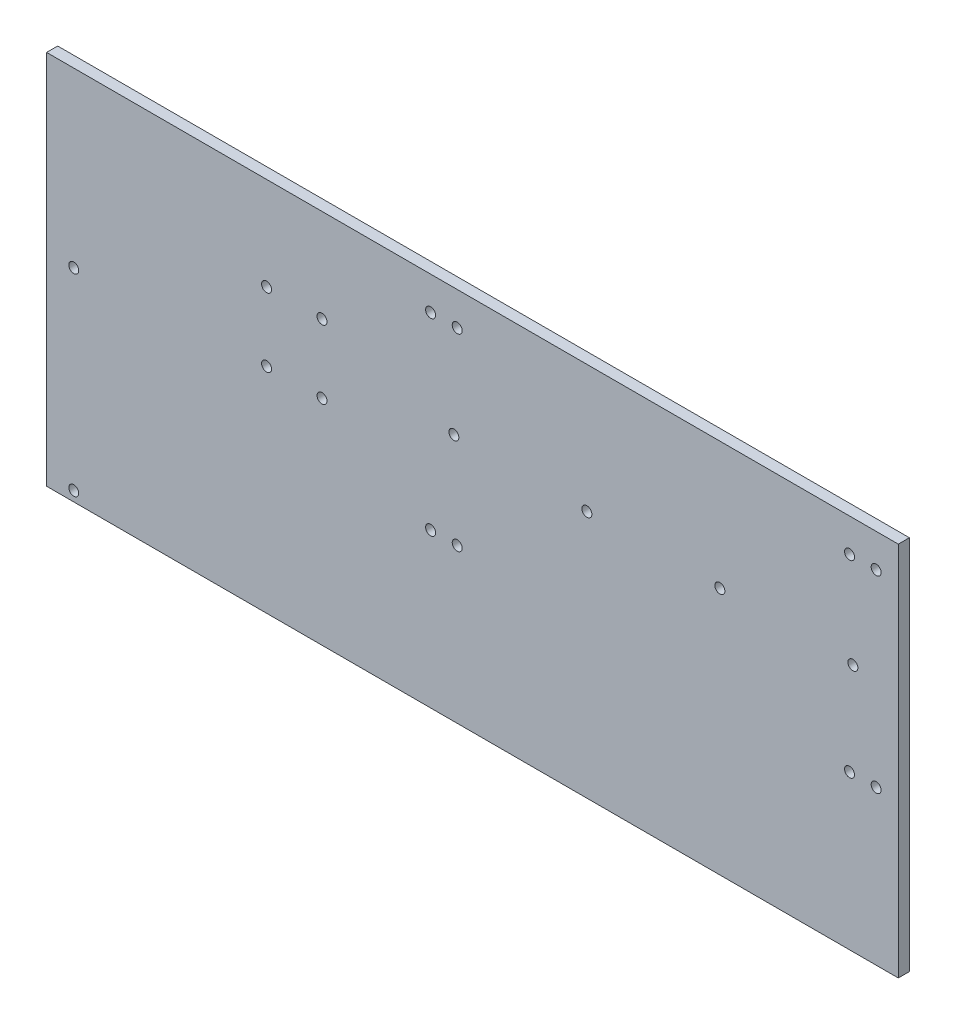
ISO-10303-21;
HEADER;
FILE_DESCRIPTION(('STEP AP214'),'2;1');
FILE_NAME('part.step','',(''),(''),'','','');
FILE_SCHEMA(('AUTOMOTIVE_DESIGN { 1 0 10303 214 1 1 1 1 }'));
ENDSEC;
DATA;
#1=APPLICATION_CONTEXT('core data for automotive mechanical design processes');
#2=APPLICATION_PROTOCOL_DEFINITION('international standard','automotive_design',2000,#1);
#3=PRODUCT_CONTEXT('',#1,'mechanical');
#4=PRODUCT('Part','Part','',(#3));
#5=PRODUCT_RELATED_PRODUCT_CATEGORY('part','',(#4));
#6=PRODUCT_DEFINITION_FORMATION('','',#4);
#7=PRODUCT_DEFINITION_CONTEXT('part definition',#1,'design');
#8=PRODUCT_DEFINITION('design','',#6,#7);
#9=PRODUCT_DEFINITION_SHAPE('','',#8);
#10=(LENGTH_UNIT() NAMED_UNIT(*) SI_UNIT(.MILLI.,.METRE.));
#11=(NAMED_UNIT(*) PLANE_ANGLE_UNIT() SI_UNIT($,.RADIAN.));
#12=(NAMED_UNIT(*) SI_UNIT($,.STERADIAN.) SOLID_ANGLE_UNIT());
#13=UNCERTAINTY_MEASURE_WITH_UNIT(LENGTH_MEASURE(1.E-05),#10,'distance_accuracy_value','');
#14=(GEOMETRIC_REPRESENTATION_CONTEXT(3) GLOBAL_UNCERTAINTY_ASSIGNED_CONTEXT((#13)) GLOBAL_UNIT_ASSIGNED_CONTEXT((#10,
#11,#12)) REPRESENTATION_CONTEXT('',''));
#15=CARTESIAN_POINT('',(0.,0.,0.));
#16=DIRECTION('',(0.,0.,1.));
#17=DIRECTION('',(1.,0.,0.));
#18=AXIS2_PLACEMENT_3D('',#15,#16,#17);
#19=CARTESIAN_POINT('',(192.118943375933,-84.7583573717352,5.));
#20=DIRECTION('',(-1.,0.,0.));
#21=DIRECTION('',(0.,0.,1.));
#22=AXIS2_PLACEMENT_3D('',#19,#20,#21);
#23=PLANE('',#22);
#24=DIRECTION('',(0.,1.,0.));
#25=VECTOR('',#24,1.);
#26=CARTESIAN_POINT('',(192.118943375933,-84.7583573717352,0.));
#27=LINE('',#26,#25);
#28=CARTESIAN_POINT('',(192.118943375933,-84.7583573717352,0.));
#29=VERTEX_POINT('',#28);
#30=CARTESIAN_POINT('',(192.118943375933,84.7583573717352,0.));
#31=VERTEX_POINT('',#30);
#32=EDGE_CURVE('E96',#29,#31,#27,.T.);
#33=ORIENTED_EDGE('',*,*,#32,.T.);
#34=DIRECTION('',(0.,0.,-1.));
#35=VECTOR('',#34,1.);
#36=CARTESIAN_POINT('',(192.118943375933,84.7583573717352,5.));
#37=LINE('',#36,#35);
#38=CARTESIAN_POINT('',(192.118943375933,84.7583573717352,5.));
#39=VERTEX_POINT('',#38);
#40=EDGE_CURVE('E11',#39,#31,#37,.T.);
#41=ORIENTED_EDGE('',*,*,#40,.F.);
#42=DIRECTION('',(0.,1.,0.));
#43=VECTOR('',#42,1.);
#44=CARTESIAN_POINT('',(192.118943375933,-84.7583573717352,5.));
#45=LINE('',#44,#43);
#46=CARTESIAN_POINT('',(192.118943375933,-84.7583573717352,5.));
#47=VERTEX_POINT('',#46);
#48=EDGE_CURVE('E84',#47,#39,#45,.T.);
#49=ORIENTED_EDGE('',*,*,#48,.F.);
#50=DIRECTION('',(0.,0.,-1.));
#51=VECTOR('',#50,1.);
#52=CARTESIAN_POINT('',(192.118943375933,-84.7583573717352,5.));
#53=LINE('',#52,#51);
#54=EDGE_CURVE('E92',#47,#29,#53,.T.);
#55=ORIENTED_EDGE('',*,*,#54,.T.);
#56=EDGE_LOOP('',(#33,#41,#49,#55));
#57=FACE_BOUND('',#56,.T.);
#58=ADVANCED_FACE('F33',(#57),#23,.F.);
#59=CARTESIAN_POINT('',(-192.118943375933,84.7583573717352,5.));
#60=DIRECTION('',(0.,-1.,0.));
#61=DIRECTION('',(0.,0.,-1.));
#62=AXIS2_PLACEMENT_3D('',#59,#60,#61);
#63=PLANE('',#62);
#64=DIRECTION('',(-1.,0.,0.));
#65=VECTOR('',#64,1.);
#66=CARTESIAN_POINT('',(-192.118943375933,84.7583573717352,0.));
#67=LINE('',#66,#65);
#68=CARTESIAN_POINT('',(-192.118943375933,84.7583573717352,0.));
#69=VERTEX_POINT('',#68);
#70=EDGE_CURVE('E88',#31,#69,#67,.T.);
#71=ORIENTED_EDGE('',*,*,#70,.T.);
#72=DIRECTION('',(0.,0.,-1.));
#73=VECTOR('',#72,1.);
#74=CARTESIAN_POINT('',(-192.118943375933,84.7583573717352,5.));
#75=LINE('',#74,#73);
#76=CARTESIAN_POINT('',(-192.118943375933,84.7583573717352,5.));
#77=VERTEX_POINT('',#76);
#78=EDGE_CURVE('E41',#77,#69,#75,.T.);
#79=ORIENTED_EDGE('',*,*,#78,.F.);
#80=DIRECTION('',(-1.,0.,0.));
#81=VECTOR('',#80,1.);
#82=CARTESIAN_POINT('',(-192.118943375933,84.7583573717352,5.));
#83=LINE('',#82,#81);
#84=EDGE_CURVE('E79',#39,#77,#83,.T.);
#85=ORIENTED_EDGE('',*,*,#84,.F.);
#86=ORIENTED_EDGE('',*,*,#40,.T.);
#87=EDGE_LOOP('',(#71,#79,#85,#86));
#88=FACE_BOUND('',#87,.T.);
#89=ADVANCED_FACE('F87',(#88),#63,.F.);
#90=CARTESIAN_POINT('',(-192.118943375933,-84.7583573717352,5.));
#91=DIRECTION('',(1.,0.,0.));
#92=DIRECTION('',(0.,0.,-1.));
#93=AXIS2_PLACEMENT_3D('',#90,#91,#92);
#94=PLANE('',#93);
#95=DIRECTION('',(0.,-1.,0.));
#96=VECTOR('',#95,1.);
#97=CARTESIAN_POINT('',(-192.118943375933,-84.7583573717352,0.));
#98=LINE('',#97,#96);
#99=CARTESIAN_POINT('',(-192.118943375933,-84.7583573717352,0.));
#100=VERTEX_POINT('',#99);
#101=EDGE_CURVE('E66',#69,#100,#98,.T.);
#102=ORIENTED_EDGE('',*,*,#101,.T.);
#103=DIRECTION('',(0.,0.,-1.));
#104=VECTOR('',#103,1.);
#105=CARTESIAN_POINT('',(-192.118943375933,-84.7583573717352,5.));
#106=LINE('',#105,#104);
#107=CARTESIAN_POINT('',(-192.118943375933,-84.7583573717352,5.));
#108=VERTEX_POINT('',#107);
#109=EDGE_CURVE('E89',#108,#100,#106,.T.);
#110=ORIENTED_EDGE('',*,*,#109,.F.);
#111=DIRECTION('',(0.,-1.,0.));
#112=VECTOR('',#111,1.);
#113=CARTESIAN_POINT('',(-192.118943375933,-84.7583573717352,5.));
#114=LINE('',#113,#112);
#115=EDGE_CURVE('E82',#77,#108,#114,.T.);
#116=ORIENTED_EDGE('',*,*,#115,.F.);
#117=ORIENTED_EDGE('',*,*,#78,.T.);
#118=EDGE_LOOP('',(#102,#110,#116,#117));
#119=FACE_BOUND('',#118,.T.);
#120=ADVANCED_FACE('F90',(#119),#94,.F.);
#121=CARTESIAN_POINT('',(-192.118943375933,-84.7583573717352,5.));
#122=DIRECTION('',(0.,1.,0.));
#123=DIRECTION('',(0.,0.,1.));
#124=AXIS2_PLACEMENT_3D('',#121,#122,#123);
#125=PLANE('',#124);
#126=DIRECTION('',(1.,0.,0.));
#127=VECTOR('',#126,1.);
#128=CARTESIAN_POINT('',(-192.118943375933,-84.7583573717352,0.));
#129=LINE('',#128,#127);
#130=EDGE_CURVE('E72',#100,#29,#129,.T.);
#131=ORIENTED_EDGE('',*,*,#130,.T.);
#132=ORIENTED_EDGE('',*,*,#54,.F.);
#133=DIRECTION('',(1.,0.,0.));
#134=VECTOR('',#133,1.);
#135=CARTESIAN_POINT('',(-192.118943375933,-84.7583573717352,5.));
#136=LINE('',#135,#134);
#137=EDGE_CURVE('E49',#108,#47,#136,.T.);
#138=ORIENTED_EDGE('',*,*,#137,.F.);
#139=ORIENTED_EDGE('',*,*,#109,.T.);
#140=EDGE_LOOP('',(#131,#132,#138,#139));
#141=FACE_BOUND('',#140,.T.);
#142=ADVANCED_FACE('F104',(#141),#125,.F.);
#143=CARTESIAN_POINT('',(0.,0.,5.));
#144=DIRECTION('',(0.,0.,-1.));
#145=DIRECTION('',(-1.,0.,0.));
#146=AXIS2_PLACEMENT_3D('',#143,#144,#145);
#147=PLANE('',#146);
#148=CARTESIAN_POINT('',(-179.868943375933,6.7416426282691,5.));
#149=DIRECTION('',(0.,0.,-1.));
#150=DIRECTION('',(-1.,0.,0.));
#151=AXIS2_PLACEMENT_3D('',#148,#149,#150);
#152=CIRCLE('',#151,2.25);
#153=CARTESIAN_POINT('',(-182.118943375933,6.7416426282691,5.));
#154=VERTEX_POINT('',#153);
#155=EDGE_CURVE('E211',#154,#154,#152,.T.);
#156=ORIENTED_EDGE('',*,*,#155,.T.);
#157=EDGE_LOOP('',(#156));
#158=FACE_BOUND('',#157,.T.);
#159=CARTESIAN_POINT('',(-179.868943375934,-80.2583573717309,5.));
#160=DIRECTION('',(0.,0.,-1.));
#161=DIRECTION('',(-1.,0.,0.));
#162=AXIS2_PLACEMENT_3D('',#159,#160,#161);
#163=CIRCLE('',#162,2.25);
#164=CARTESIAN_POINT('',(-182.118943375934,-80.2583573717309,5.));
#165=VERTEX_POINT('',#164);
#166=EDGE_CURVE('E205',#165,#165,#163,.T.);
#167=ORIENTED_EDGE('',*,*,#166,.T.);
#168=EDGE_LOOP('',(#167));
#169=FACE_BOUND('',#168,.T.);
#170=CARTESIAN_POINT('',(-92.8810566240669,42.7583573717334,5.));
#171=DIRECTION('',(0.,0.,-1.));
#172=DIRECTION('',(-1.,0.,0.));
#173=AXIS2_PLACEMENT_3D('',#170,#171,#172);
#174=CIRCLE('',#173,2.25);
#175=CARTESIAN_POINT('',(-95.1310566240669,42.7583573717334,5.));
#176=VERTEX_POINT('',#175);
#177=EDGE_CURVE('E199',#176,#176,#174,.T.);
#178=ORIENTED_EDGE('',*,*,#177,.T.);
#179=EDGE_LOOP('',(#178));
#180=FACE_BOUND('',#179,.T.);
#181=CARTESIAN_POINT('',(-92.8810566240669,11.7583573717333,5.));
#182=DIRECTION('',(0.,0.,-1.));
#183=DIRECTION('',(-1.,0.,0.));
#184=AXIS2_PLACEMENT_3D('',#181,#182,#183);
#185=CIRCLE('',#184,2.25);
#186=CARTESIAN_POINT('',(-95.1310566240669,11.7583573717333,5.));
#187=VERTEX_POINT('',#186);
#188=EDGE_CURVE('E193',#187,#187,#185,.T.);
#189=ORIENTED_EDGE('',*,*,#188,.T.);
#190=EDGE_LOOP('',(#189));
#191=FACE_BOUND('',#190,.T.);
#192=CARTESIAN_POINT('',(-67.8810566240669,11.7583573717336,5.));
#193=DIRECTION('',(0.,0.,-1.));
#194=DIRECTION('',(-1.,0.,0.));
#195=AXIS2_PLACEMENT_3D('',#192,#193,#194);
#196=CIRCLE('',#195,2.25);
#197=CARTESIAN_POINT('',(-70.1310566240669,11.7583573717336,5.));
#198=VERTEX_POINT('',#197);
#199=EDGE_CURVE('E187',#198,#198,#196,.T.);
#200=ORIENTED_EDGE('',*,*,#199,.T.);
#201=EDGE_LOOP('',(#200));
#202=FACE_BOUND('',#201,.T.);
#203=CARTESIAN_POINT('',(-67.8810566240669,42.7583573717335,5.));
#204=DIRECTION('',(0.,0.,-1.));
#205=DIRECTION('',(-1.,0.,0.));
#206=AXIS2_PLACEMENT_3D('',#203,#204,#205);
#207=CIRCLE('',#206,2.25);
#208=CARTESIAN_POINT('',(-70.1310566240669,42.7583573717335,5.));
#209=VERTEX_POINT('',#208);
#210=EDGE_CURVE('E181',#209,#209,#207,.T.);
#211=ORIENTED_EDGE('',*,*,#210,.T.);
#212=EDGE_LOOP('',(#211));
#213=FACE_BOUND('',#212,.T.);
#214=CARTESIAN_POINT('',(-18.8810566240669,69.758357371734,5.));
#215=DIRECTION('',(0.,0.,-1.));
#216=DIRECTION('',(-1.,0.,0.));
#217=AXIS2_PLACEMENT_3D('',#214,#215,#216);
#218=CIRCLE('',#217,2.25);
#219=CARTESIAN_POINT('',(-21.1310566240669,69.758357371734,5.));
#220=VERTEX_POINT('',#219);
#221=EDGE_CURVE('E175',#220,#220,#218,.T.);
#222=ORIENTED_EDGE('',*,*,#221,.T.);
#223=EDGE_LOOP('',(#222));
#224=FACE_BOUND('',#223,.T.);
#225=CARTESIAN_POINT('',(-6.88105662406685,69.758357371734,5.));
#226=DIRECTION('',(0.,0.,-1.));
#227=DIRECTION('',(-1.,0.,0.));
#228=AXIS2_PLACEMENT_3D('',#225,#226,#227);
#229=CIRCLE('',#228,2.25);
#230=CARTESIAN_POINT('',(-9.13105662406685,69.758357371734,5.));
#231=VERTEX_POINT('',#230);
#232=EDGE_CURVE('E169',#231,#231,#229,.T.);
#233=ORIENTED_EDGE('',*,*,#232,.T.);
#234=EDGE_LOOP('',(#233));
#235=FACE_BOUND('',#234,.T.);
#236=CARTESIAN_POINT('',(-8.38105662406685,27.2583573717339,5.));
#237=DIRECTION('',(0.,0.,-1.));
#238=DIRECTION('',(-1.,0.,0.));
#239=AXIS2_PLACEMENT_3D('',#236,#237,#238);
#240=CIRCLE('',#239,2.25);
#241=CARTESIAN_POINT('',(-10.6310566240669,27.2583573717339,5.));
#242=VERTEX_POINT('',#241);
#243=EDGE_CURVE('E163',#242,#242,#240,.T.);
#244=ORIENTED_EDGE('',*,*,#243,.T.);
#245=EDGE_LOOP('',(#244));
#246=FACE_BOUND('',#245,.T.);
#247=CARTESIAN_POINT('',(-18.8810566240669,-15.241642628266,5.));
#248=DIRECTION('',(0.,0.,-1.));
#249=DIRECTION('',(-1.,0.,0.));
#250=AXIS2_PLACEMENT_3D('',#247,#248,#249);
#251=CIRCLE('',#250,2.25);
#252=CARTESIAN_POINT('',(-21.1310566240669,-15.241642628266,5.));
#253=VERTEX_POINT('',#252);
#254=EDGE_CURVE('E157',#253,#253,#251,.T.);
#255=ORIENTED_EDGE('',*,*,#254,.T.);
#256=EDGE_LOOP('',(#255));
#257=FACE_BOUND('',#256,.T.);
#258=CARTESIAN_POINT('',(-6.88105662406685,-15.241642628266,5.));
#259=DIRECTION('',(0.,0.,-1.));
#260=DIRECTION('',(-1.,0.,0.));
#261=AXIS2_PLACEMENT_3D('',#258,#259,#260);
#262=CIRCLE('',#261,2.25);
#263=CARTESIAN_POINT('',(-9.13105662406685,-15.241642628266,5.));
#264=VERTEX_POINT('',#263);
#265=EDGE_CURVE('E151',#264,#264,#262,.T.);
#266=ORIENTED_EDGE('',*,*,#265,.T.);
#267=EDGE_LOOP('',(#266));
#268=FACE_BOUND('',#267,.T.);
#269=CARTESIAN_POINT('',(51.6189433759331,27.2583573717344,5.));
#270=DIRECTION('',(0.,0.,-1.));
#271=DIRECTION('',(-1.,0.,0.));
#272=AXIS2_PLACEMENT_3D('',#269,#270,#271);
#273=CIRCLE('',#272,2.25);
#274=CARTESIAN_POINT('',(49.3689433759331,27.2583573717344,5.));
#275=VERTEX_POINT('',#274);
#276=EDGE_CURVE('E145',#275,#275,#273,.T.);
#277=ORIENTED_EDGE('',*,*,#276,.T.);
#278=EDGE_LOOP('',(#277));
#279=FACE_BOUND('',#278,.T.);
#280=CARTESIAN_POINT('',(111.618943375933,27.2583573717348,5.));
#281=DIRECTION('',(0.,0.,-1.));
#282=DIRECTION('',(-1.,0.,0.));
#283=AXIS2_PLACEMENT_3D('',#280,#281,#282);
#284=CIRCLE('',#283,2.25);
#285=CARTESIAN_POINT('',(109.368943375933,27.2583573717348,5.));
#286=VERTEX_POINT('',#285);
#287=EDGE_CURVE('E139',#286,#286,#284,.T.);
#288=ORIENTED_EDGE('',*,*,#287,.T.);
#289=EDGE_LOOP('',(#288));
#290=FACE_BOUND('',#289,.T.);
#291=CARTESIAN_POINT('',(171.618943375933,27.2583573717352,5.));
#292=DIRECTION('',(0.,0.,-1.));
#293=DIRECTION('',(-1.,0.,0.));
#294=AXIS2_PLACEMENT_3D('',#291,#292,#293);
#295=CIRCLE('',#294,2.25);
#296=CARTESIAN_POINT('',(169.368943375933,27.2583573717352,5.));
#297=VERTEX_POINT('',#296);
#298=EDGE_CURVE('E133',#297,#297,#295,.T.);
#299=ORIENTED_EDGE('',*,*,#298,.T.);
#300=EDGE_LOOP('',(#299));
#301=FACE_BOUND('',#300,.T.);
#302=CARTESIAN_POINT('',(170.118943375933,-15.2416426282647,5.));
#303=DIRECTION('',(0.,0.,-1.));
#304=DIRECTION('',(-1.,0.,0.));
#305=AXIS2_PLACEMENT_3D('',#302,#303,#304);
#306=CIRCLE('',#305,2.25);
#307=CARTESIAN_POINT('',(167.868943375933,-15.2416426282647,5.));
#308=VERTEX_POINT('',#307);
#309=EDGE_CURVE('E127',#308,#308,#306,.T.);
#310=ORIENTED_EDGE('',*,*,#309,.T.);
#311=EDGE_LOOP('',(#310));
#312=FACE_BOUND('',#311,.T.);
#313=CARTESIAN_POINT('',(182.118943375933,-15.2416426282648,5.));
#314=DIRECTION('',(0.,0.,-1.));
#315=DIRECTION('',(-1.,0.,0.));
#316=AXIS2_PLACEMENT_3D('',#313,#314,#315);
#317=CIRCLE('',#316,2.25);
#318=CARTESIAN_POINT('',(179.868943375933,-15.2416426282648,5.));
#319=VERTEX_POINT('',#318);
#320=EDGE_CURVE('E121',#319,#319,#317,.T.);
#321=ORIENTED_EDGE('',*,*,#320,.T.);
#322=EDGE_LOOP('',(#321));
#323=FACE_BOUND('',#322,.T.);
#324=CARTESIAN_POINT('',(170.118943375933,69.7583573717352,5.));
#325=DIRECTION('',(0.,0.,-1.));
#326=DIRECTION('',(-1.,0.,0.));
#327=AXIS2_PLACEMENT_3D('',#324,#325,#326);
#328=CIRCLE('',#327,2.25);
#329=CARTESIAN_POINT('',(167.868943375933,69.7583573717352,5.));
#330=VERTEX_POINT('',#329);
#331=EDGE_CURVE('E115',#330,#330,#328,.T.);
#332=ORIENTED_EDGE('',*,*,#331,.T.);
#333=EDGE_LOOP('',(#332));
#334=FACE_BOUND('',#333,.T.);
#335=CARTESIAN_POINT('',(182.118943375933,69.7583573717352,5.));
#336=DIRECTION('',(0.,0.,-1.));
#337=DIRECTION('',(-1.,0.,0.));
#338=AXIS2_PLACEMENT_3D('',#335,#336,#337);
#339=CIRCLE('',#338,2.25);
#340=CARTESIAN_POINT('',(179.868943375933,69.7583573717352,5.));
#341=VERTEX_POINT('',#340);
#342=EDGE_CURVE('E99',#341,#341,#339,.T.);
#343=ORIENTED_EDGE('',*,*,#342,.T.);
#344=EDGE_LOOP('',(#343));
#345=FACE_BOUND('',#344,.T.);
#346=ORIENTED_EDGE('',*,*,#48,.T.);
#347=ORIENTED_EDGE('',*,*,#84,.T.);
#348=ORIENTED_EDGE('',*,*,#115,.T.);
#349=ORIENTED_EDGE('',*,*,#137,.T.);
#350=EDGE_LOOP('',(#346,#347,#348,#349));
#351=FACE_BOUND('',#350,.T.);
#352=ADVANCED_FACE('F80',(#158,#169,#180,#191,#202,#213,#224,#235,#246,#257,#268,#279,#290,#301,
#312,#323,#334,#345,#351),#147,.F.);
#353=CARTESIAN_POINT('',(0.,0.,0.));
#354=DIRECTION('',(0.,0.,-1.));
#355=DIRECTION('',(-1.,0.,0.));
#356=AXIS2_PLACEMENT_3D('',#353,#354,#355);
#357=PLANE('',#356);
#358=CARTESIAN_POINT('',(-179.868943375933,6.7416426282691,0.));
#359=DIRECTION('',(0.,0.,-1.));
#360=DIRECTION('',(-1.,0.,0.));
#361=AXIS2_PLACEMENT_3D('',#358,#359,#360);
#362=CIRCLE('',#361,2.24999999999997);
#363=CARTESIAN_POINT('',(-182.118943375933,6.7416426282691,0.));
#364=VERTEX_POINT('',#363);
#365=EDGE_CURVE('E214',#364,#364,#362,.T.);
#366=ORIENTED_EDGE('',*,*,#365,.F.);
#367=EDGE_LOOP('',(#366));
#368=FACE_BOUND('',#367,.T.);
#369=CARTESIAN_POINT('',(-179.868943375934,-80.2583573717309,0.));
#370=DIRECTION('',(0.,0.,-1.));
#371=DIRECTION('',(-1.,0.,0.));
#372=AXIS2_PLACEMENT_3D('',#369,#370,#371);
#373=CIRCLE('',#372,2.24999999999997);
#374=CARTESIAN_POINT('',(-182.118943375934,-80.2583573717309,0.));
#375=VERTEX_POINT('',#374);
#376=EDGE_CURVE('E208',#375,#375,#373,.T.);
#377=ORIENTED_EDGE('',*,*,#376,.F.);
#378=EDGE_LOOP('',(#377));
#379=FACE_BOUND('',#378,.T.);
#380=CARTESIAN_POINT('',(-92.8810566240669,42.7583573717334,0.));
#381=DIRECTION('',(0.,0.,-1.));
#382=DIRECTION('',(-1.,0.,0.));
#383=AXIS2_PLACEMENT_3D('',#380,#381,#382);
#384=CIRCLE('',#383,2.24999999999999);
#385=CARTESIAN_POINT('',(-95.1310566240669,42.7583573717334,0.));
#386=VERTEX_POINT('',#385);
#387=EDGE_CURVE('E202',#386,#386,#384,.T.);
#388=ORIENTED_EDGE('',*,*,#387,.F.);
#389=EDGE_LOOP('',(#388));
#390=FACE_BOUND('',#389,.T.);
#391=CARTESIAN_POINT('',(-92.8810566240669,11.7583573717333,0.));
#392=DIRECTION('',(0.,0.,-1.));
#393=DIRECTION('',(-1.,0.,0.));
#394=AXIS2_PLACEMENT_3D('',#391,#392,#393);
#395=CIRCLE('',#394,2.24999999999999);
#396=CARTESIAN_POINT('',(-95.1310566240669,11.7583573717333,0.));
#397=VERTEX_POINT('',#396);
#398=EDGE_CURVE('E196',#397,#397,#395,.T.);
#399=ORIENTED_EDGE('',*,*,#398,.F.);
#400=EDGE_LOOP('',(#399));
#401=FACE_BOUND('',#400,.T.);
#402=CARTESIAN_POINT('',(-67.8810566240669,11.7583573717336,0.));
#403=DIRECTION('',(0.,0.,-1.));
#404=DIRECTION('',(-1.,0.,0.));
#405=AXIS2_PLACEMENT_3D('',#402,#403,#404);
#406=CIRCLE('',#405,2.24999999999999);
#407=CARTESIAN_POINT('',(-70.1310566240669,11.7583573717336,0.));
#408=VERTEX_POINT('',#407);
#409=EDGE_CURVE('E190',#408,#408,#406,.T.);
#410=ORIENTED_EDGE('',*,*,#409,.F.);
#411=EDGE_LOOP('',(#410));
#412=FACE_BOUND('',#411,.T.);
#413=CARTESIAN_POINT('',(-67.8810566240669,42.7583573717335,0.));
#414=DIRECTION('',(0.,0.,-1.));
#415=DIRECTION('',(-1.,0.,0.));
#416=AXIS2_PLACEMENT_3D('',#413,#414,#415);
#417=CIRCLE('',#416,2.24999999999999);
#418=CARTESIAN_POINT('',(-70.1310566240669,42.7583573717335,0.));
#419=VERTEX_POINT('',#418);
#420=EDGE_CURVE('E184',#419,#419,#417,.T.);
#421=ORIENTED_EDGE('',*,*,#420,.F.);
#422=EDGE_LOOP('',(#421));
#423=FACE_BOUND('',#422,.T.);
#424=CARTESIAN_POINT('',(-18.8810566240669,69.758357371734,0.));
#425=DIRECTION('',(0.,0.,-1.));
#426=DIRECTION('',(-1.,0.,0.));
#427=AXIS2_PLACEMENT_3D('',#424,#425,#426);
#428=CIRCLE('',#427,2.24999999999999);
#429=CARTESIAN_POINT('',(-21.1310566240669,69.758357371734,0.));
#430=VERTEX_POINT('',#429);
#431=EDGE_CURVE('E178',#430,#430,#428,.T.);
#432=ORIENTED_EDGE('',*,*,#431,.F.);
#433=EDGE_LOOP('',(#432));
#434=FACE_BOUND('',#433,.T.);
#435=CARTESIAN_POINT('',(-6.88105662406685,69.758357371734,0.));
#436=DIRECTION('',(0.,0.,-1.));
#437=DIRECTION('',(-1.,0.,0.));
#438=AXIS2_PLACEMENT_3D('',#435,#436,#437);
#439=CIRCLE('',#438,2.24999999999999);
#440=CARTESIAN_POINT('',(-9.13105662406684,69.758357371734,0.));
#441=VERTEX_POINT('',#440);
#442=EDGE_CURVE('E172',#441,#441,#439,.T.);
#443=ORIENTED_EDGE('',*,*,#442,.F.);
#444=EDGE_LOOP('',(#443));
#445=FACE_BOUND('',#444,.T.);
#446=CARTESIAN_POINT('',(-8.38105662406685,27.2583573717339,0.));
#447=DIRECTION('',(0.,0.,-1.));
#448=DIRECTION('',(-1.,0.,0.));
#449=AXIS2_PLACEMENT_3D('',#446,#447,#448);
#450=CIRCLE('',#449,2.24999999999999);
#451=CARTESIAN_POINT('',(-10.6310566240668,27.2583573717339,0.));
#452=VERTEX_POINT('',#451);
#453=EDGE_CURVE('E166',#452,#452,#450,.T.);
#454=ORIENTED_EDGE('',*,*,#453,.F.);
#455=EDGE_LOOP('',(#454));
#456=FACE_BOUND('',#455,.T.);
#457=CARTESIAN_POINT('',(-18.8810566240669,-15.241642628266,0.));
#458=DIRECTION('',(0.,0.,-1.));
#459=DIRECTION('',(-1.,0.,0.));
#460=AXIS2_PLACEMENT_3D('',#457,#458,#459);
#461=CIRCLE('',#460,2.24999999999999);
#462=CARTESIAN_POINT('',(-21.1310566240669,-15.241642628266,0.));
#463=VERTEX_POINT('',#462);
#464=EDGE_CURVE('E160',#463,#463,#461,.T.);
#465=ORIENTED_EDGE('',*,*,#464,.F.);
#466=EDGE_LOOP('',(#465));
#467=FACE_BOUND('',#466,.T.);
#468=CARTESIAN_POINT('',(-6.88105662406685,-15.241642628266,0.));
#469=DIRECTION('',(0.,0.,-1.));
#470=DIRECTION('',(-1.,0.,0.));
#471=AXIS2_PLACEMENT_3D('',#468,#469,#470);
#472=CIRCLE('',#471,2.24999999999999);
#473=CARTESIAN_POINT('',(-9.13105662406684,-15.241642628266,0.));
#474=VERTEX_POINT('',#473);
#475=EDGE_CURVE('E154',#474,#474,#472,.T.);
#476=ORIENTED_EDGE('',*,*,#475,.F.);
#477=EDGE_LOOP('',(#476));
#478=FACE_BOUND('',#477,.T.);
#479=CARTESIAN_POINT('',(51.6189433759331,27.2583573717344,0.));
#480=DIRECTION('',(0.,0.,-1.));
#481=DIRECTION('',(-1.,0.,0.));
#482=AXIS2_PLACEMENT_3D('',#479,#480,#481);
#483=CIRCLE('',#482,2.24999999999999);
#484=CARTESIAN_POINT('',(49.3689433759332,27.2583573717344,0.));
#485=VERTEX_POINT('',#484);
#486=EDGE_CURVE('E148',#485,#485,#483,.T.);
#487=ORIENTED_EDGE('',*,*,#486,.F.);
#488=EDGE_LOOP('',(#487));
#489=FACE_BOUND('',#488,.T.);
#490=CARTESIAN_POINT('',(111.618943375933,27.2583573717348,0.));
#491=DIRECTION('',(0.,0.,-1.));
#492=DIRECTION('',(-1.,0.,0.));
#493=AXIS2_PLACEMENT_3D('',#490,#491,#492);
#494=CIRCLE('',#493,2.24999999999999);
#495=CARTESIAN_POINT('',(109.368943375933,27.2583573717348,0.));
#496=VERTEX_POINT('',#495);
#497=EDGE_CURVE('E142',#496,#496,#494,.T.);
#498=ORIENTED_EDGE('',*,*,#497,.F.);
#499=EDGE_LOOP('',(#498));
#500=FACE_BOUND('',#499,.T.);
#501=CARTESIAN_POINT('',(171.618943375933,27.2583573717352,0.));
#502=DIRECTION('',(0.,0.,-1.));
#503=DIRECTION('',(-1.,0.,0.));
#504=AXIS2_PLACEMENT_3D('',#501,#502,#503);
#505=CIRCLE('',#504,2.24999999999997);
#506=CARTESIAN_POINT('',(169.368943375933,27.2583573717352,0.));
#507=VERTEX_POINT('',#506);
#508=EDGE_CURVE('E136',#507,#507,#505,.T.);
#509=ORIENTED_EDGE('',*,*,#508,.F.);
#510=EDGE_LOOP('',(#509));
#511=FACE_BOUND('',#510,.T.);
#512=CARTESIAN_POINT('',(170.118943375933,-15.2416426282647,0.));
#513=DIRECTION('',(0.,0.,-1.));
#514=DIRECTION('',(-1.,0.,0.));
#515=AXIS2_PLACEMENT_3D('',#512,#513,#514);
#516=CIRCLE('',#515,2.24999999999997);
#517=CARTESIAN_POINT('',(167.868943375933,-15.2416426282647,0.));
#518=VERTEX_POINT('',#517);
#519=EDGE_CURVE('E130',#518,#518,#516,.T.);
#520=ORIENTED_EDGE('',*,*,#519,.F.);
#521=EDGE_LOOP('',(#520));
#522=FACE_BOUND('',#521,.T.);
#523=CARTESIAN_POINT('',(182.118943375933,-15.2416426282648,0.));
#524=DIRECTION('',(0.,0.,-1.));
#525=DIRECTION('',(-1.,0.,0.));
#526=AXIS2_PLACEMENT_3D('',#523,#524,#525);
#527=CIRCLE('',#526,2.24999999999997);
#528=CARTESIAN_POINT('',(179.868943375933,-15.2416426282648,0.));
#529=VERTEX_POINT('',#528);
#530=EDGE_CURVE('E124',#529,#529,#527,.T.);
#531=ORIENTED_EDGE('',*,*,#530,.F.);
#532=EDGE_LOOP('',(#531));
#533=FACE_BOUND('',#532,.T.);
#534=CARTESIAN_POINT('',(170.118943375933,69.7583573717352,0.));
#535=DIRECTION('',(0.,0.,-1.));
#536=DIRECTION('',(-1.,0.,0.));
#537=AXIS2_PLACEMENT_3D('',#534,#535,#536);
#538=CIRCLE('',#537,2.24999999999997);
#539=CARTESIAN_POINT('',(167.868943375933,69.7583573717352,0.));
#540=VERTEX_POINT('',#539);
#541=EDGE_CURVE('E118',#540,#540,#538,.T.);
#542=ORIENTED_EDGE('',*,*,#541,.F.);
#543=EDGE_LOOP('',(#542));
#544=FACE_BOUND('',#543,.T.);
#545=CARTESIAN_POINT('',(182.118943375933,69.7583573717352,0.));
#546=DIRECTION('',(0.,0.,-1.));
#547=DIRECTION('',(-1.,0.,0.));
#548=AXIS2_PLACEMENT_3D('',#545,#546,#547);
#549=CIRCLE('',#548,2.24999999999997);
#550=CARTESIAN_POINT('',(179.868943375933,69.7583573717352,0.));
#551=VERTEX_POINT('',#550);
#552=EDGE_CURVE('E112',#551,#551,#549,.T.);
#553=ORIENTED_EDGE('',*,*,#552,.F.);
#554=EDGE_LOOP('',(#553));
#555=FACE_BOUND('',#554,.T.);
#556=ORIENTED_EDGE('',*,*,#32,.F.);
#557=ORIENTED_EDGE('',*,*,#130,.F.);
#558=ORIENTED_EDGE('',*,*,#101,.F.);
#559=ORIENTED_EDGE('',*,*,#70,.F.);
#560=EDGE_LOOP('',(#556,#557,#558,#559));
#561=FACE_BOUND('',#560,.T.);
#562=ADVANCED_FACE('F107',(#368,#379,#390,#401,#412,#423,#434,#445,#456,#467,#478,#489,#500,
#511,#522,#533,#544,#555,#561),#357,.T.);
#563=CARTESIAN_POINT('',(182.118943375933,69.7583573717352,0.));
#564=DIRECTION('',(0.,0.,-1.));
#565=DIRECTION('',(-1.,0.,0.));
#566=AXIS2_PLACEMENT_3D('',#563,#564,#565);
#567=CYLINDRICAL_SURFACE('',#566,2.24999999999999);
#568=ORIENTED_EDGE('',*,*,#342,.F.);
#569=EDGE_LOOP('',(#568));
#570=FACE_BOUND('',#569,.T.);
#571=ORIENTED_EDGE('',*,*,#552,.T.);
#572=EDGE_LOOP('',(#571));
#573=FACE_BOUND('',#572,.T.);
#574=ADVANCED_FACE('F222',(#570,#573),#567,.F.);
#575=CARTESIAN_POINT('',(170.118943375933,69.7583573717352,0.));
#576=DIRECTION('',(0.,0.,-1.));
#577=DIRECTION('',(-1.,0.,0.));
#578=AXIS2_PLACEMENT_3D('',#575,#576,#577);
#579=CYLINDRICAL_SURFACE('',#578,2.24999999999999);
#580=ORIENTED_EDGE('',*,*,#331,.F.);
#581=EDGE_LOOP('',(#580));
#582=FACE_BOUND('',#581,.T.);
#583=ORIENTED_EDGE('',*,*,#541,.T.);
#584=EDGE_LOOP('',(#583));
#585=FACE_BOUND('',#584,.T.);
#586=ADVANCED_FACE('F259',(#582,#585),#579,.F.);
#587=CARTESIAN_POINT('',(182.118943375933,-15.2416426282648,0.));
#588=DIRECTION('',(0.,0.,-1.));
#589=DIRECTION('',(-1.,0.,0.));
#590=AXIS2_PLACEMENT_3D('',#587,#588,#589);
#591=CYLINDRICAL_SURFACE('',#590,2.24999999999999);
#592=ORIENTED_EDGE('',*,*,#320,.F.);
#593=EDGE_LOOP('',(#592));
#594=FACE_BOUND('',#593,.T.);
#595=ORIENTED_EDGE('',*,*,#530,.T.);
#596=EDGE_LOOP('',(#595));
#597=FACE_BOUND('',#596,.T.);
#598=ADVANCED_FACE('F265',(#594,#597),#591,.F.);
#599=CARTESIAN_POINT('',(170.118943375933,-15.2416426282647,0.));
#600=DIRECTION('',(0.,0.,-1.));
#601=DIRECTION('',(-1.,0.,0.));
#602=AXIS2_PLACEMENT_3D('',#599,#600,#601);
#603=CYLINDRICAL_SURFACE('',#602,2.24999999999999);
#604=ORIENTED_EDGE('',*,*,#309,.F.);
#605=EDGE_LOOP('',(#604));
#606=FACE_BOUND('',#605,.T.);
#607=ORIENTED_EDGE('',*,*,#519,.T.);
#608=EDGE_LOOP('',(#607));
#609=FACE_BOUND('',#608,.T.);
#610=ADVANCED_FACE('F322',(#606,#609),#603,.F.);
#611=CARTESIAN_POINT('',(171.618943375933,27.2583573717352,0.));
#612=DIRECTION('',(0.,0.,-1.));
#613=DIRECTION('',(-1.,0.,0.));
#614=AXIS2_PLACEMENT_3D('',#611,#612,#613);
#615=CYLINDRICAL_SURFACE('',#614,2.24999999999999);
#616=ORIENTED_EDGE('',*,*,#298,.F.);
#617=EDGE_LOOP('',(#616));
#618=FACE_BOUND('',#617,.T.);
#619=ORIENTED_EDGE('',*,*,#508,.T.);
#620=EDGE_LOOP('',(#619));
#621=FACE_BOUND('',#620,.T.);
#622=ADVANCED_FACE('F327',(#618,#621),#615,.F.);
#623=CARTESIAN_POINT('',(111.618943375933,27.2583573717348,0.));
#624=DIRECTION('',(0.,0.,-1.));
#625=DIRECTION('',(-1.,0.,0.));
#626=AXIS2_PLACEMENT_3D('',#623,#624,#625);
#627=CYLINDRICAL_SURFACE('',#626,2.25);
#628=ORIENTED_EDGE('',*,*,#287,.F.);
#629=EDGE_LOOP('',(#628));
#630=FACE_BOUND('',#629,.T.);
#631=ORIENTED_EDGE('',*,*,#497,.T.);
#632=EDGE_LOOP('',(#631));
#633=FACE_BOUND('',#632,.T.);
#634=ADVANCED_FACE('F333',(#630,#633),#627,.F.);
#635=CARTESIAN_POINT('',(51.6189433759331,27.2583573717344,0.));
#636=DIRECTION('',(0.,0.,-1.));
#637=DIRECTION('',(-1.,0.,0.));
#638=AXIS2_PLACEMENT_3D('',#635,#636,#637);
#639=CYLINDRICAL_SURFACE('',#638,2.25);
#640=ORIENTED_EDGE('',*,*,#276,.F.);
#641=EDGE_LOOP('',(#640));
#642=FACE_BOUND('',#641,.T.);
#643=ORIENTED_EDGE('',*,*,#486,.T.);
#644=EDGE_LOOP('',(#643));
#645=FACE_BOUND('',#644,.T.);
#646=ADVANCED_FACE('F337',(#642,#645),#639,.F.);
#647=CARTESIAN_POINT('',(-6.88105662406685,-15.241642628266,0.));
#648=DIRECTION('',(0.,0.,-1.));
#649=DIRECTION('',(-1.,0.,0.));
#650=AXIS2_PLACEMENT_3D('',#647,#648,#649);
#651=CYLINDRICAL_SURFACE('',#650,2.24999999999999);
#652=ORIENTED_EDGE('',*,*,#265,.F.);
#653=EDGE_LOOP('',(#652));
#654=FACE_BOUND('',#653,.T.);
#655=ORIENTED_EDGE('',*,*,#475,.T.);
#656=EDGE_LOOP('',(#655));
#657=FACE_BOUND('',#656,.T.);
#658=ADVANCED_FACE('F341',(#654,#657),#651,.F.);
#659=CARTESIAN_POINT('',(-18.8810566240669,-15.241642628266,0.));
#660=DIRECTION('',(0.,0.,-1.));
#661=DIRECTION('',(-1.,0.,0.));
#662=AXIS2_PLACEMENT_3D('',#659,#660,#661);
#663=CYLINDRICAL_SURFACE('',#662,2.24999999999999);
#664=ORIENTED_EDGE('',*,*,#254,.F.);
#665=EDGE_LOOP('',(#664));
#666=FACE_BOUND('',#665,.T.);
#667=ORIENTED_EDGE('',*,*,#464,.T.);
#668=EDGE_LOOP('',(#667));
#669=FACE_BOUND('',#668,.T.);
#670=ADVANCED_FACE('F345',(#666,#669),#663,.F.);
#671=CARTESIAN_POINT('',(-8.38105662406685,27.2583573717339,0.));
#672=DIRECTION('',(0.,0.,-1.));
#673=DIRECTION('',(-1.,0.,0.));
#674=AXIS2_PLACEMENT_3D('',#671,#672,#673);
#675=CYLINDRICAL_SURFACE('',#674,2.24999999999999);
#676=ORIENTED_EDGE('',*,*,#243,.F.);
#677=EDGE_LOOP('',(#676));
#678=FACE_BOUND('',#677,.T.);
#679=ORIENTED_EDGE('',*,*,#453,.T.);
#680=EDGE_LOOP('',(#679));
#681=FACE_BOUND('',#680,.T.);
#682=ADVANCED_FACE('F349',(#678,#681),#675,.F.);
#683=CARTESIAN_POINT('',(-6.88105662406685,69.758357371734,0.));
#684=DIRECTION('',(0.,0.,-1.));
#685=DIRECTION('',(-1.,0.,0.));
#686=AXIS2_PLACEMENT_3D('',#683,#684,#685);
#687=CYLINDRICAL_SURFACE('',#686,2.24999999999999);
#688=ORIENTED_EDGE('',*,*,#232,.F.);
#689=EDGE_LOOP('',(#688));
#690=FACE_BOUND('',#689,.T.);
#691=ORIENTED_EDGE('',*,*,#442,.T.);
#692=EDGE_LOOP('',(#691));
#693=FACE_BOUND('',#692,.T.);
#694=ADVANCED_FACE('F353',(#690,#693),#687,.F.);
#695=CARTESIAN_POINT('',(-18.8810566240669,69.758357371734,0.));
#696=DIRECTION('',(0.,0.,-1.));
#697=DIRECTION('',(-1.,0.,0.));
#698=AXIS2_PLACEMENT_3D('',#695,#696,#697);
#699=CYLINDRICAL_SURFACE('',#698,2.24999999999999);
#700=ORIENTED_EDGE('',*,*,#221,.F.);
#701=EDGE_LOOP('',(#700));
#702=FACE_BOUND('',#701,.T.);
#703=ORIENTED_EDGE('',*,*,#431,.T.);
#704=EDGE_LOOP('',(#703));
#705=FACE_BOUND('',#704,.T.);
#706=ADVANCED_FACE('F357',(#702,#705),#699,.F.);
#707=CARTESIAN_POINT('',(-67.8810566240669,42.7583573717335,0.));
#708=DIRECTION('',(0.,0.,-1.));
#709=DIRECTION('',(-1.,0.,0.));
#710=AXIS2_PLACEMENT_3D('',#707,#708,#709);
#711=CYLINDRICAL_SURFACE('',#710,2.25);
#712=ORIENTED_EDGE('',*,*,#210,.F.);
#713=EDGE_LOOP('',(#712));
#714=FACE_BOUND('',#713,.T.);
#715=ORIENTED_EDGE('',*,*,#420,.T.);
#716=EDGE_LOOP('',(#715));
#717=FACE_BOUND('',#716,.T.);
#718=ADVANCED_FACE('F361',(#714,#717),#711,.F.);
#719=CARTESIAN_POINT('',(-67.8810566240669,11.7583573717336,0.));
#720=DIRECTION('',(0.,0.,-1.));
#721=DIRECTION('',(-1.,0.,0.));
#722=AXIS2_PLACEMENT_3D('',#719,#720,#721);
#723=CYLINDRICAL_SURFACE('',#722,2.25);
#724=ORIENTED_EDGE('',*,*,#199,.F.);
#725=EDGE_LOOP('',(#724));
#726=FACE_BOUND('',#725,.T.);
#727=ORIENTED_EDGE('',*,*,#409,.T.);
#728=EDGE_LOOP('',(#727));
#729=FACE_BOUND('',#728,.T.);
#730=ADVANCED_FACE('F365',(#726,#729),#723,.F.);
#731=CARTESIAN_POINT('',(-92.8810566240669,11.7583573717333,0.));
#732=DIRECTION('',(0.,0.,-1.));
#733=DIRECTION('',(-1.,0.,0.));
#734=AXIS2_PLACEMENT_3D('',#731,#732,#733);
#735=CYLINDRICAL_SURFACE('',#734,2.25);
#736=ORIENTED_EDGE('',*,*,#188,.F.);
#737=EDGE_LOOP('',(#736));
#738=FACE_BOUND('',#737,.T.);
#739=ORIENTED_EDGE('',*,*,#398,.T.);
#740=EDGE_LOOP('',(#739));
#741=FACE_BOUND('',#740,.T.);
#742=ADVANCED_FACE('F369',(#738,#741),#735,.F.);
#743=CARTESIAN_POINT('',(-92.8810566240669,42.7583573717334,0.));
#744=DIRECTION('',(0.,0.,-1.));
#745=DIRECTION('',(-1.,0.,0.));
#746=AXIS2_PLACEMENT_3D('',#743,#744,#745);
#747=CYLINDRICAL_SURFACE('',#746,2.25);
#748=ORIENTED_EDGE('',*,*,#177,.F.);
#749=EDGE_LOOP('',(#748));
#750=FACE_BOUND('',#749,.T.);
#751=ORIENTED_EDGE('',*,*,#387,.T.);
#752=EDGE_LOOP('',(#751));
#753=FACE_BOUND('',#752,.T.);
#754=ADVANCED_FACE('F373',(#750,#753),#747,.F.);
#755=CARTESIAN_POINT('',(-179.868943375934,-80.2583573717309,0.));
#756=DIRECTION('',(0.,0.,-1.));
#757=DIRECTION('',(-1.,0.,0.));
#758=AXIS2_PLACEMENT_3D('',#755,#756,#757);
#759=CYLINDRICAL_SURFACE('',#758,2.24999999999999);
#760=ORIENTED_EDGE('',*,*,#166,.F.);
#761=EDGE_LOOP('',(#760));
#762=FACE_BOUND('',#761,.T.);
#763=ORIENTED_EDGE('',*,*,#376,.T.);
#764=EDGE_LOOP('',(#763));
#765=FACE_BOUND('',#764,.T.);
#766=ADVANCED_FACE('F377',(#762,#765),#759,.F.);
#767=CARTESIAN_POINT('',(-179.868943375933,6.7416426282691,0.));
#768=DIRECTION('',(0.,0.,-1.));
#769=DIRECTION('',(-1.,0.,0.));
#770=AXIS2_PLACEMENT_3D('',#767,#768,#769);
#771=CYLINDRICAL_SURFACE('',#770,2.24999999999999);
#772=ORIENTED_EDGE('',*,*,#155,.F.);
#773=EDGE_LOOP('',(#772));
#774=FACE_BOUND('',#773,.T.);
#775=ORIENTED_EDGE('',*,*,#365,.T.);
#776=EDGE_LOOP('',(#775));
#777=FACE_BOUND('',#776,.T.);
#778=ADVANCED_FACE('F218',(#774,#777),#771,.F.);
#779=CLOSED_SHELL('',(#58,#89,#120,#142,#352,#562,#574,#586,#598,#610,#622,#634,#646,#658,#670,
#682,#694,#706,#718,#730,#742,#754,#766,#778));
#780=MANIFOLD_SOLID_BREP('B2',#779);
#781=ADVANCED_BREP_SHAPE_REPRESENTATION('',(#18,#780),#14);
#782=SHAPE_DEFINITION_REPRESENTATION(#9,#781);
ENDSEC;
END-ISO-10303-21;
